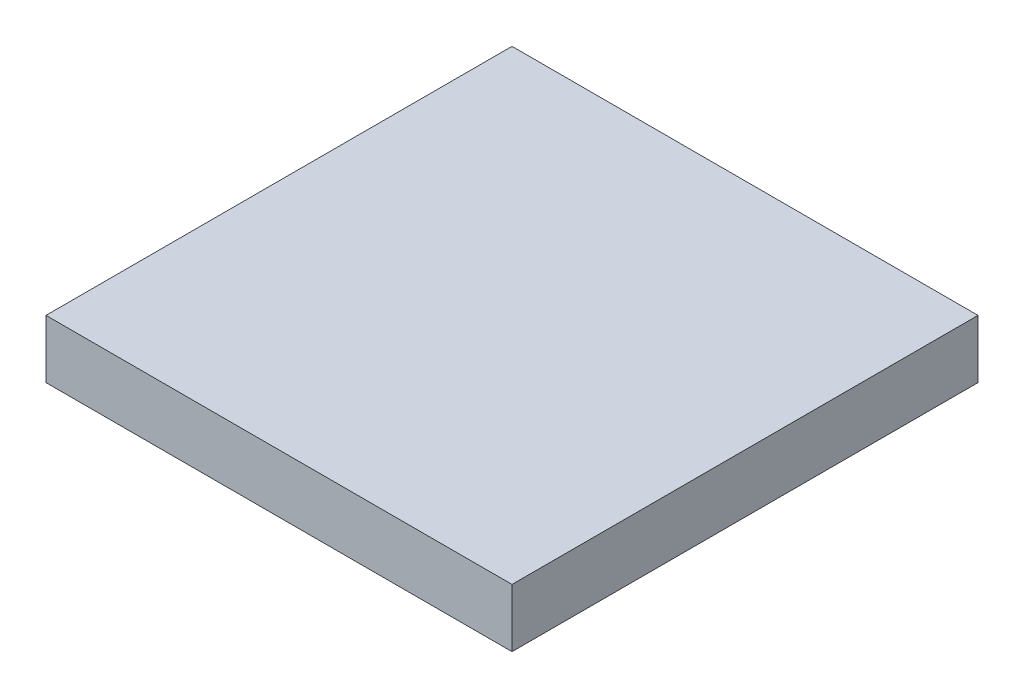
ISO-10303-21;
HEADER;
FILE_DESCRIPTION(('STEP AP214'),'2;1');
FILE_NAME('part.step','',(''),(''),'','','');
FILE_SCHEMA(('AUTOMOTIVE_DESIGN { 1 0 10303 214 1 1 1 1 }'));
ENDSEC;
DATA;
#1=APPLICATION_CONTEXT('core data for automotive mechanical design processes');
#2=APPLICATION_PROTOCOL_DEFINITION('international standard','automotive_design',2000,#1);
#3=PRODUCT_CONTEXT('',#1,'mechanical');
#4=PRODUCT('Part','Part','',(#3));
#5=PRODUCT_RELATED_PRODUCT_CATEGORY('part','',(#4));
#6=PRODUCT_DEFINITION_FORMATION('','',#4);
#7=PRODUCT_DEFINITION_CONTEXT('part definition',#1,'design');
#8=PRODUCT_DEFINITION('design','',#6,#7);
#9=PRODUCT_DEFINITION_SHAPE('','',#8);
#10=(LENGTH_UNIT() NAMED_UNIT(*) SI_UNIT(.MILLI.,.METRE.));
#11=(NAMED_UNIT(*) PLANE_ANGLE_UNIT() SI_UNIT($,.RADIAN.));
#12=(NAMED_UNIT(*) SI_UNIT($,.STERADIAN.) SOLID_ANGLE_UNIT());
#13=UNCERTAINTY_MEASURE_WITH_UNIT(LENGTH_MEASURE(1.E-05),#10,'distance_accuracy_value','');
#14=(GEOMETRIC_REPRESENTATION_CONTEXT(3) GLOBAL_UNCERTAINTY_ASSIGNED_CONTEXT((#13)) GLOBAL_UNIT_ASSIGNED_CONTEXT((#10,
#11,#12)) REPRESENTATION_CONTEXT('',''));
#15=CARTESIAN_POINT('',(0.,0.,0.));
#16=DIRECTION('',(0.,0.,1.));
#17=DIRECTION('',(1.,0.,0.));
#18=AXIS2_PLACEMENT_3D('',#15,#16,#17);
#19=CARTESIAN_POINT('',(-100.,25.,-200.));
#20=DIRECTION('',(1.,0.,0.));
#21=DIRECTION('',(0.,0.,-1.));
#22=AXIS2_PLACEMENT_3D('',#19,#20,#21);
#23=PLANE('',#22);
#24=DIRECTION('',(0.,0.,1.));
#25=VECTOR('',#24,1.);
#26=CARTESIAN_POINT('',(-100.,0.,-200.));
#27=LINE('',#26,#25);
#28=CARTESIAN_POINT('',(-100.,0.,-200.));
#29=VERTEX_POINT('',#28);
#30=CARTESIAN_POINT('',(-100.,0.,0.));
#31=VERTEX_POINT('',#30);
#32=EDGE_CURVE('E111',#29,#31,#27,.T.);
#33=ORIENTED_EDGE('',*,*,#32,.T.);
#34=DIRECTION('',(0.,-1.,0.));
#35=VECTOR('',#34,1.);
#36=CARTESIAN_POINT('',(-100.,25.,0.));
#37=LINE('',#36,#35);
#38=CARTESIAN_POINT('',(-100.,25.,0.));
#39=VERTEX_POINT('',#38);
#40=EDGE_CURVE('E11',#39,#31,#37,.T.);
#41=ORIENTED_EDGE('',*,*,#40,.F.);
#42=DIRECTION('',(0.,0.,1.));
#43=VECTOR('',#42,1.);
#44=CARTESIAN_POINT('',(-100.,25.,-200.));
#45=LINE('',#44,#43);
#46=CARTESIAN_POINT('',(-100.,25.,-200.));
#47=VERTEX_POINT('',#46);
#48=EDGE_CURVE('E95',#47,#39,#45,.T.);
#49=ORIENTED_EDGE('',*,*,#48,.F.);
#50=DIRECTION('',(0.,-1.,0.));
#51=VECTOR('',#50,1.);
#52=CARTESIAN_POINT('',(-100.,25.,-200.));
#53=LINE('',#52,#51);
#54=EDGE_CURVE('E107',#47,#29,#53,.T.);
#55=ORIENTED_EDGE('',*,*,#54,.T.);
#56=EDGE_LOOP('',(#33,#41,#49,#55));
#57=FACE_BOUND('',#56,.T.);
#58=ADVANCED_FACE('F43',(#57),#23,.F.);
#59=CARTESIAN_POINT('',(-100.,25.,0.));
#60=DIRECTION('',(0.,0.,-1.));
#61=DIRECTION('',(-1.,0.,0.));
#62=AXIS2_PLACEMENT_3D('',#59,#60,#61);
#63=PLANE('',#62);
#64=DIRECTION('',(1.,0.,0.));
#65=VECTOR('',#64,1.);
#66=CARTESIAN_POINT('',(-100.,0.,0.));
#67=LINE('',#66,#65);
#68=CARTESIAN_POINT('',(100.,0.,0.));
#69=VERTEX_POINT('',#68);
#70=EDGE_CURVE('E100',#31,#69,#67,.T.);
#71=ORIENTED_EDGE('',*,*,#70,.T.);
#72=DIRECTION('',(0.,-1.,0.));
#73=VECTOR('',#72,1.);
#74=CARTESIAN_POINT('',(100.,25.,0.));
#75=LINE('',#74,#73);
#76=CARTESIAN_POINT('',(100.,25.,0.));
#77=VERTEX_POINT('',#76);
#78=EDGE_CURVE('E52',#77,#69,#75,.T.);
#79=ORIENTED_EDGE('',*,*,#78,.F.);
#80=DIRECTION('',(1.,0.,0.));
#81=VECTOR('',#80,1.);
#82=CARTESIAN_POINT('',(-100.,25.,0.));
#83=LINE('',#82,#81);
#84=EDGE_CURVE('E90',#39,#77,#83,.T.);
#85=ORIENTED_EDGE('',*,*,#84,.F.);
#86=ORIENTED_EDGE('',*,*,#40,.T.);
#87=EDGE_LOOP('',(#71,#79,#85,#86));
#88=FACE_BOUND('',#87,.T.);
#89=ADVANCED_FACE('F99',(#88),#63,.F.);
#90=CARTESIAN_POINT('',(100.,25.,-200.));
#91=DIRECTION('',(-1.,0.,0.));
#92=DIRECTION('',(0.,0.,1.));
#93=AXIS2_PLACEMENT_3D('',#90,#91,#92);
#94=PLANE('',#93);
#95=DIRECTION('',(0.,0.,-1.));
#96=VECTOR('',#95,1.);
#97=CARTESIAN_POINT('',(100.,0.,-200.));
#98=LINE('',#97,#96);
#99=CARTESIAN_POINT('',(100.,0.,-200.));
#100=VERTEX_POINT('',#99);
#101=EDGE_CURVE('E77',#69,#100,#98,.T.);
#102=ORIENTED_EDGE('',*,*,#101,.T.);
#103=DIRECTION('',(0.,-1.,0.));
#104=VECTOR('',#103,1.);
#105=CARTESIAN_POINT('',(100.,25.,-200.));
#106=LINE('',#105,#104);
#107=CARTESIAN_POINT('',(100.,25.,-200.));
#108=VERTEX_POINT('',#107);
#109=EDGE_CURVE('E102',#108,#100,#106,.T.);
#110=ORIENTED_EDGE('',*,*,#109,.F.);
#111=DIRECTION('',(0.,0.,-1.));
#112=VECTOR('',#111,1.);
#113=CARTESIAN_POINT('',(100.,25.,-200.));
#114=LINE('',#113,#112);
#115=EDGE_CURVE('E93',#77,#108,#114,.T.);
#116=ORIENTED_EDGE('',*,*,#115,.F.);
#117=ORIENTED_EDGE('',*,*,#78,.T.);
#118=EDGE_LOOP('',(#102,#110,#116,#117));
#119=FACE_BOUND('',#118,.T.);
#120=ADVANCED_FACE('F103',(#119),#94,.F.);
#121=CARTESIAN_POINT('',(-100.,25.,-200.));
#122=DIRECTION('',(0.,0.,1.));
#123=DIRECTION('',(1.,0.,0.));
#124=AXIS2_PLACEMENT_3D('',#121,#122,#123);
#125=PLANE('',#124);
#126=DIRECTION('',(-1.,0.,0.));
#127=VECTOR('',#126,1.);
#128=CARTESIAN_POINT('',(-100.,0.,-200.));
#129=LINE('',#128,#127);
#130=EDGE_CURVE('E83',#100,#29,#129,.T.);
#131=ORIENTED_EDGE('',*,*,#130,.T.);
#132=ORIENTED_EDGE('',*,*,#54,.F.);
#133=DIRECTION('',(-1.,0.,0.));
#134=VECTOR('',#133,1.);
#135=CARTESIAN_POINT('',(-100.,25.,-200.));
#136=LINE('',#135,#134);
#137=EDGE_CURVE('E60',#108,#47,#136,.T.);
#138=ORIENTED_EDGE('',*,*,#137,.F.);
#139=ORIENTED_EDGE('',*,*,#109,.T.);
#140=EDGE_LOOP('',(#131,#132,#138,#139));
#141=FACE_BOUND('',#140,.T.);
#142=ADVANCED_FACE('F124',(#141),#125,.F.);
#143=CARTESIAN_POINT('',(0.,25.,0.));
#144=DIRECTION('',(0.,1.,0.));
#145=DIRECTION('',(0.,0.,1.));
#146=AXIS2_PLACEMENT_3D('',#143,#144,#145);
#147=PLANE('',#146);
#148=ORIENTED_EDGE('',*,*,#48,.T.);
#149=ORIENTED_EDGE('',*,*,#84,.T.);
#150=ORIENTED_EDGE('',*,*,#115,.T.);
#151=ORIENTED_EDGE('',*,*,#137,.T.);
#152=EDGE_LOOP('',(#148,#149,#150,#151));
#153=FACE_BOUND('',#152,.T.);
#154=ADVANCED_FACE('F91',(#153),#147,.T.);
#155=CARTESIAN_POINT('',(0.,0.,0.));
#156=DIRECTION('',(0.,1.,0.));
#157=DIRECTION('',(0.,0.,1.));
#158=AXIS2_PLACEMENT_3D('',#155,#156,#157);
#159=PLANE('',#158);
#160=ORIENTED_EDGE('',*,*,#32,.F.);
#161=ORIENTED_EDGE('',*,*,#130,.F.);
#162=ORIENTED_EDGE('',*,*,#101,.F.);
#163=ORIENTED_EDGE('',*,*,#70,.F.);
#164=EDGE_LOOP('',(#160,#161,#162,#163));
#165=FACE_BOUND('',#164,.T.);
#166=ADVANCED_FACE('F127',(#165),#159,.F.);
#167=CLOSED_SHELL('',(#58,#89,#120,#142,#154,#166));
#168=MANIFOLD_SOLID_BREP('B2',#167);
#169=ADVANCED_BREP_SHAPE_REPRESENTATION('',(#18,#168),#14);
#170=SHAPE_DEFINITION_REPRESENTATION(#9,#169);
ENDSEC;
END-ISO-10303-21;
